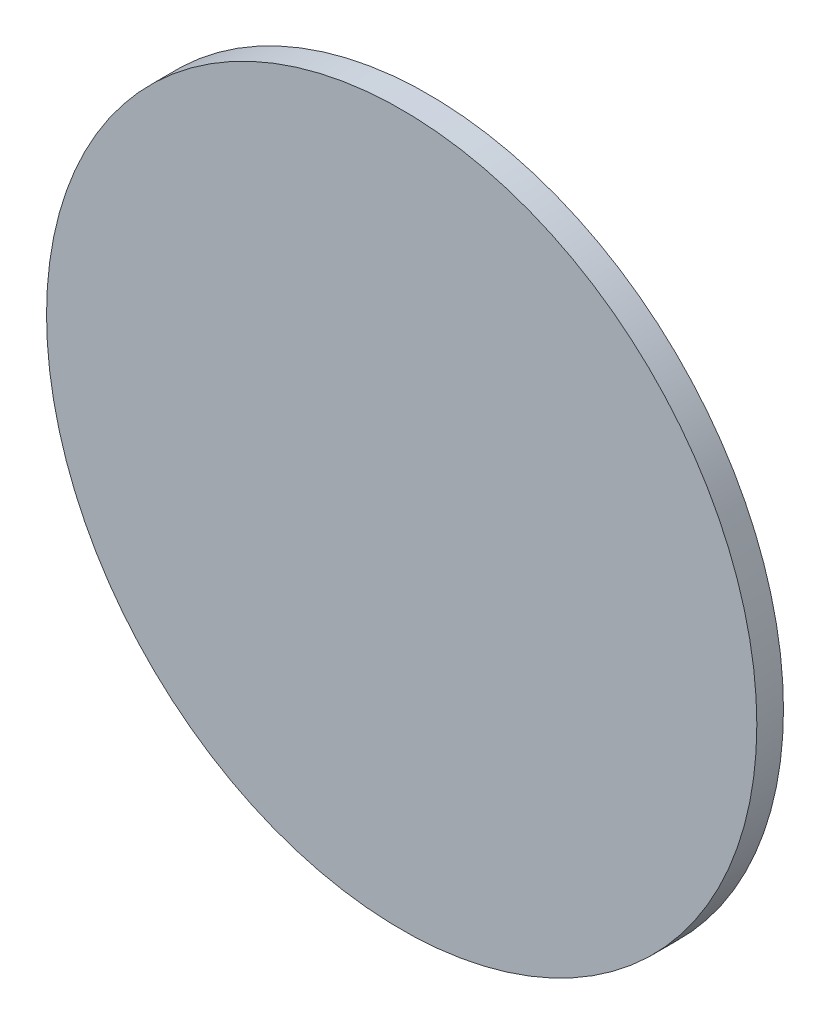
ISO-10303-21;
HEADER;
FILE_DESCRIPTION(('STEP AP214'),'2;1');
FILE_NAME('part.step','',(''),(''),'','','');
FILE_SCHEMA(('AUTOMOTIVE_DESIGN { 1 0 10303 214 1 1 1 1 }'));
ENDSEC;
DATA;
#1=APPLICATION_CONTEXT('core data for automotive mechanical design processes');
#2=APPLICATION_PROTOCOL_DEFINITION('international standard','automotive_design',2000,#1);
#3=PRODUCT_CONTEXT('',#1,'mechanical');
#4=PRODUCT('Part','Part','',(#3));
#5=PRODUCT_RELATED_PRODUCT_CATEGORY('part','',(#4));
#6=PRODUCT_DEFINITION_FORMATION('','',#4);
#7=PRODUCT_DEFINITION_CONTEXT('part definition',#1,'design');
#8=PRODUCT_DEFINITION('design','',#6,#7);
#9=PRODUCT_DEFINITION_SHAPE('','',#8);
#10=(LENGTH_UNIT() NAMED_UNIT(*) SI_UNIT(.MILLI.,.METRE.));
#11=(NAMED_UNIT(*) PLANE_ANGLE_UNIT() SI_UNIT($,.RADIAN.));
#12=(NAMED_UNIT(*) SI_UNIT($,.STERADIAN.) SOLID_ANGLE_UNIT());
#13=UNCERTAINTY_MEASURE_WITH_UNIT(LENGTH_MEASURE(1.E-05),#10,'distance_accuracy_value','');
#14=(GEOMETRIC_REPRESENTATION_CONTEXT(3) GLOBAL_UNCERTAINTY_ASSIGNED_CONTEXT((#13)) GLOBAL_UNIT_ASSIGNED_CONTEXT((#10,
#11,#12)) REPRESENTATION_CONTEXT('',''));
#15=CARTESIAN_POINT('',(0.,0.,0.));
#16=DIRECTION('',(0.,0.,1.));
#17=DIRECTION('',(1.,0.,0.));
#18=AXIS2_PLACEMENT_3D('',#15,#16,#17);
#19=CARTESIAN_POINT('',(0.,0.,6.));
#20=DIRECTION('',(0.,0.,-1.));
#21=DIRECTION('',(-1.,0.,0.));
#22=AXIS2_PLACEMENT_3D('',#19,#20,#21);
#23=CYLINDRICAL_SURFACE('',#22,80.);
#24=CARTESIAN_POINT('',(0.,0.,6.));
#25=DIRECTION('',(0.,0.,1.));
#26=DIRECTION('',(1.,0.,0.));
#27=AXIS2_PLACEMENT_3D('',#24,#25,#26);
#28=CIRCLE('',#27,80.);
#29=CARTESIAN_POINT('',(80.,0.,6.));
#30=VERTEX_POINT('',#29);
#31=EDGE_CURVE('E10',#30,#30,#28,.T.);
#32=ORIENTED_EDGE('',*,*,#31,.F.);
#33=EDGE_LOOP('',(#32));
#34=FACE_BOUND('',#33,.T.);
#35=CARTESIAN_POINT('',(0.,0.,0.));
#36=DIRECTION('',(0.,0.,1.));
#37=DIRECTION('',(1.,0.,0.));
#38=AXIS2_PLACEMENT_3D('',#35,#36,#37);
#39=CIRCLE('',#38,80.);
#40=CARTESIAN_POINT('',(80.,0.,0.));
#41=VERTEX_POINT('',#40);
#42=EDGE_CURVE('E36',#41,#41,#39,.T.);
#43=ORIENTED_EDGE('',*,*,#42,.T.);
#44=EDGE_LOOP('',(#43));
#45=FACE_BOUND('',#44,.T.);
#46=ADVANCED_FACE('F33',(#34,#45),#23,.T.);
#47=CARTESIAN_POINT('',(0.,0.,6.));
#48=DIRECTION('',(0.,0.,1.));
#49=DIRECTION('',(1.,0.,0.));
#50=AXIS2_PLACEMENT_3D('',#47,#48,#49);
#51=PLANE('',#50);
#52=ORIENTED_EDGE('',*,*,#31,.T.);
#53=EDGE_LOOP('',(#52));
#54=FACE_BOUND('',#53,.T.);
#55=ADVANCED_FACE('F48',(#54),#51,.T.);
#56=CARTESIAN_POINT('',(0.,0.,0.));
#57=DIRECTION('',(0.,0.,1.));
#58=DIRECTION('',(1.,0.,0.));
#59=AXIS2_PLACEMENT_3D('',#56,#57,#58);
#60=PLANE('',#59);
#61=ORIENTED_EDGE('',*,*,#42,.F.);
#62=EDGE_LOOP('',(#61));
#63=FACE_BOUND('',#62,.T.);
#64=ADVANCED_FACE('F46',(#63),#60,.F.);
#65=CLOSED_SHELL('',(#46,#55,#64));
#66=MANIFOLD_SOLID_BREP('B2',#65);
#67=ADVANCED_BREP_SHAPE_REPRESENTATION('',(#18,#66),#14);
#68=SHAPE_DEFINITION_REPRESENTATION(#9,#67);
ENDSEC;
END-ISO-10303-21;
